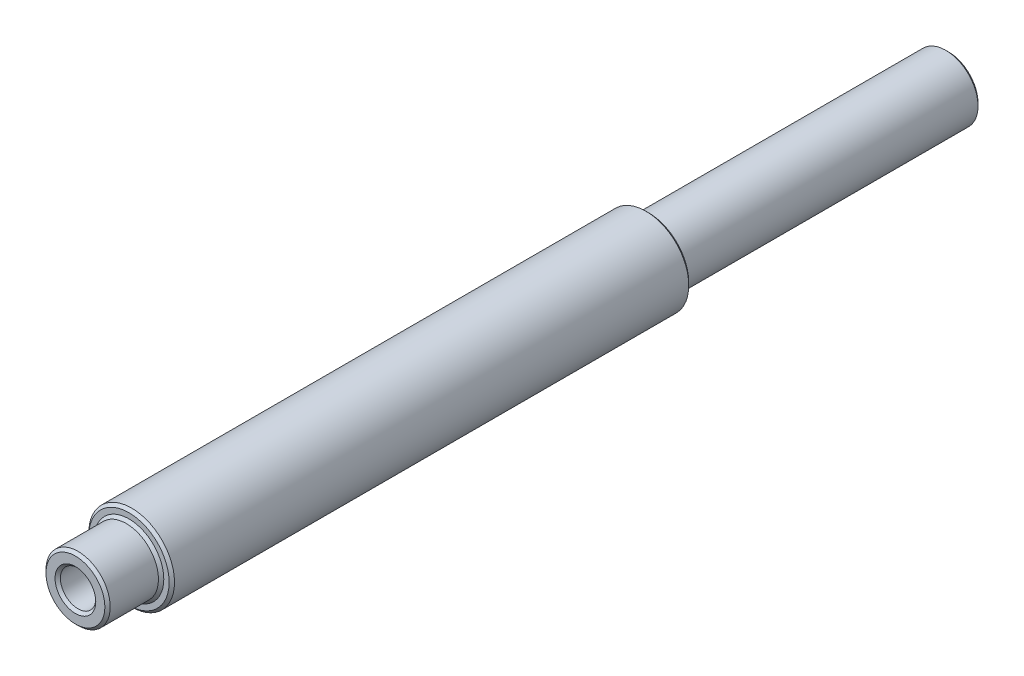
ISO-10303-21;
HEADER;
FILE_DESCRIPTION(('STEP AP214'),'2;1');
FILE_NAME('part.step','',(''),(''),'','','');
FILE_SCHEMA(('AUTOMOTIVE_DESIGN { 1 0 10303 214 1 1 1 1 }'));
ENDSEC;
DATA;
#1=APPLICATION_CONTEXT('core data for automotive mechanical design processes');
#2=APPLICATION_PROTOCOL_DEFINITION('international standard','automotive_design',2000,#1);
#3=PRODUCT_CONTEXT('',#1,'mechanical');
#4=PRODUCT('Part','Part','',(#3));
#5=PRODUCT_RELATED_PRODUCT_CATEGORY('part','',(#4));
#6=PRODUCT_DEFINITION_FORMATION('','',#4);
#7=PRODUCT_DEFINITION_CONTEXT('part definition',#1,'design');
#8=PRODUCT_DEFINITION('design','',#6,#7);
#9=PRODUCT_DEFINITION_SHAPE('','',#8);
#10=(LENGTH_UNIT() NAMED_UNIT(*) SI_UNIT(.MILLI.,.METRE.));
#11=(NAMED_UNIT(*) PLANE_ANGLE_UNIT() SI_UNIT($,.RADIAN.));
#12=(NAMED_UNIT(*) SI_UNIT($,.STERADIAN.) SOLID_ANGLE_UNIT());
#13=UNCERTAINTY_MEASURE_WITH_UNIT(LENGTH_MEASURE(1.E-05),#10,'distance_accuracy_value','');
#14=(GEOMETRIC_REPRESENTATION_CONTEXT(3) GLOBAL_UNCERTAINTY_ASSIGNED_CONTEXT((#13)) GLOBAL_UNIT_ASSIGNED_CONTEXT((#10,
#11,#12)) REPRESENTATION_CONTEXT('',''));
#15=CARTESIAN_POINT('',(0.,0.,0.));
#16=DIRECTION('',(0.,0.,1.));
#17=DIRECTION('',(1.,0.,0.));
#18=AXIS2_PLACEMENT_3D('',#15,#16,#17);
#19=CARTESIAN_POINT('',(0.,0.,81.5));
#20=DIRECTION('',(0.,0.,-1.));
#21=DIRECTION('',(-1.,0.,0.));
#22=AXIS2_PLACEMENT_3D('',#19,#20,#21);
#23=CYLINDRICAL_SURFACE('',#22,4.);
#24=CARTESIAN_POINT('',(0.,0.,28.25));
#25=DIRECTION('',(0.,0.,1.));
#26=DIRECTION('',(1.,0.,0.));
#27=AXIS2_PLACEMENT_3D('',#24,#25,#26);
#28=CIRCLE('',#27,4.);
#29=CARTESIAN_POINT('',(4.,0.,28.25));
#30=VERTEX_POINT('',#29);
#31=EDGE_CURVE('E64',#30,#30,#28,.T.);
#32=ORIENTED_EDGE('',*,*,#31,.T.);
#33=EDGE_LOOP('',(#32));
#34=FACE_BOUND('',#33,.T.);
#35=CARTESIAN_POINT('',(0.,0.,76.25));
#36=DIRECTION('',(0.,0.,1.));
#37=DIRECTION('',(1.,0.,0.));
#38=AXIS2_PLACEMENT_3D('',#35,#36,#37);
#39=CIRCLE('',#38,4.);
#40=CARTESIAN_POINT('',(4.,0.,76.25));
#41=VERTEX_POINT('',#40);
#42=EDGE_CURVE('E67',#41,#41,#39,.F.);
#43=ORIENTED_EDGE('',*,*,#42,.T.);
#44=EDGE_LOOP('',(#43));
#45=FACE_BOUND('',#44,.T.);
#46=ADVANCED_FACE('F32',(#34,#45),#23,.T.);
#47=CARTESIAN_POINT('',(0.,0.,0.));
#48=DIRECTION('',(0.,0.,-1.));
#49=DIRECTION('',(-1.,0.,0.));
#50=AXIS2_PLACEMENT_3D('',#47,#48,#49);
#51=CYLINDRICAL_SURFACE('',#50,3.);
#52=CARTESIAN_POINT('',(0.,0.,0.250000000000006));
#53=DIRECTION('',(0.,0.,1.));
#54=DIRECTION('',(1.,0.,0.));
#55=AXIS2_PLACEMENT_3D('',#52,#53,#54);
#56=CIRCLE('',#55,3.);
#57=CARTESIAN_POINT('',(3.,0.,0.250000000000006));
#58=VERTEX_POINT('',#57);
#59=EDGE_CURVE('E76',#58,#58,#56,.T.);
#60=ORIENTED_EDGE('',*,*,#59,.T.);
#61=EDGE_LOOP('',(#60));
#62=FACE_BOUND('',#61,.T.);
#63=CARTESIAN_POINT('',(0.,0.,27.75));
#64=DIRECTION('',(0.,0.,1.));
#65=DIRECTION('',(1.,0.,0.));
#66=AXIS2_PLACEMENT_3D('',#63,#64,#65);
#67=CIRCLE('',#66,3.);
#68=CARTESIAN_POINT('',(3.,0.,27.75));
#69=VERTEX_POINT('',#68);
#70=EDGE_CURVE('E79',#69,#69,#67,.F.);
#71=ORIENTED_EDGE('',*,*,#70,.T.);
#72=EDGE_LOOP('',(#71));
#73=FACE_BOUND('',#72,.T.);
#74=ADVANCED_FACE('F100',(#62,#73),#51,.T.);
#75=CARTESIAN_POINT('',(0.,4.,28.));
#76=DIRECTION('',(0.,0.,1.));
#77=DIRECTION('',(1.,0.,0.));
#78=AXIS2_PLACEMENT_3D('',#75,#76,#77);
#79=PLANE('',#78);
#80=CARTESIAN_POINT('',(0.,0.,28.));
#81=DIRECTION('',(0.,0.,1.));
#82=DIRECTION('',(1.,0.,0.));
#83=AXIS2_PLACEMENT_3D('',#80,#81,#82);
#84=CIRCLE('',#83,3.24999999999998);
#85=CARTESIAN_POINT('',(3.24999999999998,0.,28.));
#86=VERTEX_POINT('',#85);
#87=EDGE_CURVE('E70',#86,#86,#84,.T.);
#88=ORIENTED_EDGE('',*,*,#87,.T.);
#89=EDGE_LOOP('',(#88));
#90=FACE_BOUND('',#89,.T.);
#91=CARTESIAN_POINT('',(0.,0.,28.));
#92=DIRECTION('',(0.,0.,1.));
#93=DIRECTION('',(1.,0.,0.));
#94=AXIS2_PLACEMENT_3D('',#91,#92,#93);
#95=CIRCLE('',#94,3.75);
#96=CARTESIAN_POINT('',(3.75,0.,28.));
#97=VERTEX_POINT('',#96);
#98=EDGE_CURVE('E73',#97,#97,#95,.F.);
#99=ORIENTED_EDGE('',*,*,#98,.T.);
#100=EDGE_LOOP('',(#99));
#101=FACE_BOUND('',#100,.T.);
#102=ADVANCED_FACE('F106',(#90,#101),#79,.F.);
#103=CARTESIAN_POINT('',(0.,0.,0.));
#104=DIRECTION('',(0.,0.,1.));
#105=DIRECTION('',(1.,0.,0.));
#106=AXIS2_PLACEMENT_3D('',#103,#104,#105);
#107=PLANE('',#106);
#108=CARTESIAN_POINT('',(0.,0.,0.));
#109=DIRECTION('',(0.,0.,1.));
#110=DIRECTION('',(1.,0.,0.));
#111=AXIS2_PLACEMENT_3D('',#108,#109,#110);
#112=CIRCLE('',#111,2.75);
#113=CARTESIAN_POINT('',(2.75,0.,0.));
#114=VERTEX_POINT('',#113);
#115=EDGE_CURVE('E82',#114,#114,#112,.F.);
#116=ORIENTED_EDGE('',*,*,#115,.T.);
#117=EDGE_LOOP('',(#116));
#118=FACE_BOUND('',#117,.T.);
#119=CARTESIAN_POINT('',(0.,0.,0.));
#120=DIRECTION('',(0.,0.,1.));
#121=DIRECTION('',(1.,0.,0.));
#122=AXIS2_PLACEMENT_3D('',#119,#120,#121);
#123=CIRCLE('',#122,1.9);
#124=CARTESIAN_POINT('',(1.9,0.,0.));
#125=VERTEX_POINT('',#124);
#126=EDGE_CURVE('E85',#125,#125,#123,.T.);
#127=ORIENTED_EDGE('',*,*,#126,.T.);
#128=EDGE_LOOP('',(#127));
#129=FACE_BOUND('',#128,.T.);
#130=ADVANCED_FACE('F89',(#118,#129),#107,.F.);
#131=CARTESIAN_POINT('',(0.,0.,81.5));
#132=DIRECTION('',(0.,0.,1.));
#133=DIRECTION('',(1.,0.,0.));
#134=AXIS2_PLACEMENT_3D('',#131,#132,#133);
#135=CYLINDRICAL_SURFACE('',#134,3.);
#136=CARTESIAN_POINT('',(0.,0.,81.25));
#137=DIRECTION('',(0.,0.,1.));
#138=DIRECTION('',(1.,0.,0.));
#139=AXIS2_PLACEMENT_3D('',#136,#137,#138);
#140=CIRCLE('',#139,3.);
#141=CARTESIAN_POINT('',(3.,0.,81.25));
#142=VERTEX_POINT('',#141);
#143=EDGE_CURVE('E52',#142,#142,#140,.F.);
#144=ORIENTED_EDGE('',*,*,#143,.T.);
#145=EDGE_LOOP('',(#144));
#146=FACE_BOUND('',#145,.T.);
#147=CARTESIAN_POINT('',(0.,0.,76.75));
#148=DIRECTION('',(0.,0.,1.));
#149=DIRECTION('',(1.,0.,0.));
#150=AXIS2_PLACEMENT_3D('',#147,#148,#149);
#151=CIRCLE('',#150,3.);
#152=CARTESIAN_POINT('',(3.,0.,76.75));
#153=VERTEX_POINT('',#152);
#154=EDGE_CURVE('E55',#153,#153,#151,.T.);
#155=ORIENTED_EDGE('',*,*,#154,.T.);
#156=EDGE_LOOP('',(#155));
#157=FACE_BOUND('',#156,.T.);
#158=ADVANCED_FACE('F145',(#146,#157),#135,.T.);
#159=CARTESIAN_POINT('',(0.,4.,76.5));
#160=DIRECTION('',(0.,0.,1.));
#161=DIRECTION('',(1.,0.,0.));
#162=AXIS2_PLACEMENT_3D('',#159,#160,#161);
#163=PLANE('',#162);
#164=CARTESIAN_POINT('',(0.,0.,76.5));
#165=DIRECTION('',(0.,0.,1.));
#166=DIRECTION('',(1.,0.,0.));
#167=AXIS2_PLACEMENT_3D('',#164,#165,#166);
#168=CIRCLE('',#167,3.25);
#169=CARTESIAN_POINT('',(3.25,0.,76.5));
#170=VERTEX_POINT('',#169);
#171=EDGE_CURVE('E43',#170,#170,#168,.F.);
#172=ORIENTED_EDGE('',*,*,#171,.T.);
#173=EDGE_LOOP('',(#172));
#174=FACE_BOUND('',#173,.T.);
#175=CARTESIAN_POINT('',(0.,0.,76.5));
#176=DIRECTION('',(0.,0.,1.));
#177=DIRECTION('',(1.,0.,0.));
#178=AXIS2_PLACEMENT_3D('',#175,#176,#177);
#179=CIRCLE('',#178,3.75000000000001);
#180=CARTESIAN_POINT('',(3.75000000000001,0.,76.5));
#181=VERTEX_POINT('',#180);
#182=EDGE_CURVE('E47',#181,#181,#179,.T.);
#183=ORIENTED_EDGE('',*,*,#182,.T.);
#184=EDGE_LOOP('',(#183));
#185=FACE_BOUND('',#184,.T.);
#186=ADVANCED_FACE('F142',(#174,#185),#163,.T.);
#187=CARTESIAN_POINT('',(0.,0.,81.5));
#188=DIRECTION('',(0.,0.,1.));
#189=DIRECTION('',(1.,0.,0.));
#190=AXIS2_PLACEMENT_3D('',#187,#188,#189);
#191=PLANE('',#190);
#192=CARTESIAN_POINT('',(0.,0.,81.5));
#193=DIRECTION('',(0.,0.,1.));
#194=DIRECTION('',(1.,0.,0.));
#195=AXIS2_PLACEMENT_3D('',#192,#193,#194);
#196=CIRCLE('',#195,2.75);
#197=CARTESIAN_POINT('',(2.75,0.,81.5));
#198=VERTEX_POINT('',#197);
#199=EDGE_CURVE('E58',#198,#198,#196,.T.);
#200=ORIENTED_EDGE('',*,*,#199,.T.);
#201=EDGE_LOOP('',(#200));
#202=FACE_BOUND('',#201,.T.);
#203=CARTESIAN_POINT('',(0.,0.,81.5));
#204=DIRECTION('',(0.,0.,1.));
#205=DIRECTION('',(1.,0.,0.));
#206=AXIS2_PLACEMENT_3D('',#203,#204,#205);
#207=CIRCLE('',#206,1.89999999999998);
#208=CARTESIAN_POINT('',(1.89999999999998,0.,81.5));
#209=VERTEX_POINT('',#208);
#210=EDGE_CURVE('E61',#209,#209,#207,.F.);
#211=ORIENTED_EDGE('',*,*,#210,.T.);
#212=EDGE_LOOP('',(#211));
#213=FACE_BOUND('',#212,.T.);
#214=ADVANCED_FACE('F144',(#202,#213),#191,.T.);
#215=CARTESIAN_POINT('',(0.,0.,81.5));
#216=DIRECTION('',(0.,0.,1.));
#217=DIRECTION('',(1.,0.,0.));
#218=AXIS2_PLACEMENT_3D('',#215,#216,#217);
#219=CYLINDRICAL_SURFACE('',#218,1.65);
#220=CARTESIAN_POINT('',(0.,0.,81.25));
#221=DIRECTION('',(0.,0.,1.));
#222=DIRECTION('',(1.,0.,0.));
#223=AXIS2_PLACEMENT_3D('',#220,#221,#222);
#224=CIRCLE('',#223,1.65);
#225=CARTESIAN_POINT('',(1.65,0.,81.25));
#226=VERTEX_POINT('',#225);
#227=EDGE_CURVE('E10',#226,#226,#224,.T.);
#228=ORIENTED_EDGE('',*,*,#227,.T.);
#229=EDGE_LOOP('',(#228));
#230=FACE_BOUND('',#229,.T.);
#231=CARTESIAN_POINT('',(0.,0.,0.25));
#232=DIRECTION('',(0.,0.,1.));
#233=DIRECTION('',(1.,0.,0.));
#234=AXIS2_PLACEMENT_3D('',#231,#232,#233);
#235=CIRCLE('',#234,1.65);
#236=CARTESIAN_POINT('',(1.65,0.,0.25));
#237=VERTEX_POINT('',#236);
#238=EDGE_CURVE('E39',#237,#237,#235,.F.);
#239=ORIENTED_EDGE('',*,*,#238,.T.);
#240=EDGE_LOOP('',(#239));
#241=FACE_BOUND('',#240,.T.);
#242=ADVANCED_FACE('F117',(#230,#241),#219,.F.);
#243=CARTESIAN_POINT('',(0.,0.,0.));
#244=DIRECTION('',(0.,0.,1.));
#245=DIRECTION('',(1.,0.,0.));
#246=AXIS2_PLACEMENT_3D('',#243,#244,#245);
#247=CONICAL_SURFACE('',#246,2.75,0.785398163397441);
#248=ORIENTED_EDGE('',*,*,#59,.F.);
#249=EDGE_LOOP('',(#248));
#250=FACE_BOUND('',#249,.T.);
#251=ORIENTED_EDGE('',*,*,#115,.F.);
#252=EDGE_LOOP('',(#251));
#253=FACE_BOUND('',#252,.T.);
#254=ADVANCED_FACE('F113',(#250,#253),#247,.T.);
#255=CARTESIAN_POINT('',(0.,0.,27.75));
#256=DIRECTION('',(0.,0.,1.));
#257=DIRECTION('',(1.,0.,0.));
#258=AXIS2_PLACEMENT_3D('',#255,#256,#257);
#259=CONICAL_SURFACE('',#258,3.,0.785398163397443);
#260=ORIENTED_EDGE('',*,*,#87,.F.);
#261=EDGE_LOOP('',(#260));
#262=FACE_BOUND('',#261,.T.);
#263=ORIENTED_EDGE('',*,*,#70,.F.);
#264=EDGE_LOOP('',(#263));
#265=FACE_BOUND('',#264,.T.);
#266=ADVANCED_FACE('F116',(#262,#265),#259,.T.);
#267=CARTESIAN_POINT('',(0.,0.,28.));
#268=DIRECTION('',(0.,0.,1.));
#269=DIRECTION('',(1.,0.,0.));
#270=AXIS2_PLACEMENT_3D('',#267,#268,#269);
#271=CONICAL_SURFACE('',#270,3.75,0.785398163397455);
#272=ORIENTED_EDGE('',*,*,#31,.F.);
#273=EDGE_LOOP('',(#272));
#274=FACE_BOUND('',#273,.T.);
#275=ORIENTED_EDGE('',*,*,#98,.F.);
#276=EDGE_LOOP('',(#275));
#277=FACE_BOUND('',#276,.T.);
#278=ADVANCED_FACE('F121',(#274,#277),#271,.T.);
#279=CARTESIAN_POINT('',(0.,0.,81.5));
#280=DIRECTION('',(0.,0.,-1.));
#281=DIRECTION('',(-1.,0.,0.));
#282=AXIS2_PLACEMENT_3D('',#279,#280,#281);
#283=CONICAL_SURFACE('',#282,2.75,0.78539816339743);
#284=ORIENTED_EDGE('',*,*,#143,.F.);
#285=EDGE_LOOP('',(#284));
#286=FACE_BOUND('',#285,.T.);
#287=ORIENTED_EDGE('',*,*,#199,.F.);
#288=EDGE_LOOP('',(#287));
#289=FACE_BOUND('',#288,.T.);
#290=ADVANCED_FACE('F125',(#286,#289),#283,.T.);
#291=CARTESIAN_POINT('',(0.,0.,76.75));
#292=DIRECTION('',(0.,0.,-1.));
#293=DIRECTION('',(-1.,0.,0.));
#294=AXIS2_PLACEMENT_3D('',#291,#292,#293);
#295=CONICAL_SURFACE('',#294,3.,0.785398163397453);
#296=ORIENTED_EDGE('',*,*,#171,.F.);
#297=EDGE_LOOP('',(#296));
#298=FACE_BOUND('',#297,.T.);
#299=ORIENTED_EDGE('',*,*,#154,.F.);
#300=EDGE_LOOP('',(#299));
#301=FACE_BOUND('',#300,.T.);
#302=ADVANCED_FACE('F129',(#298,#301),#295,.T.);
#303=CARTESIAN_POINT('',(0.,0.,76.5));
#304=DIRECTION('',(0.,0.,-1.));
#305=DIRECTION('',(-1.,0.,0.));
#306=AXIS2_PLACEMENT_3D('',#303,#304,#305);
#307=CONICAL_SURFACE('',#306,3.75000000000001,0.785398163397428);
#308=ORIENTED_EDGE('',*,*,#42,.F.);
#309=EDGE_LOOP('',(#308));
#310=FACE_BOUND('',#309,.T.);
#311=ORIENTED_EDGE('',*,*,#182,.F.);
#312=EDGE_LOOP('',(#311));
#313=FACE_BOUND('',#312,.T.);
#314=ADVANCED_FACE('F97',(#310,#313),#307,.T.);
#315=CARTESIAN_POINT('',(0.,0.,81.25));
#316=DIRECTION('',(0.,0.,1.));
#317=DIRECTION('',(1.,0.,0.));
#318=AXIS2_PLACEMENT_3D('',#315,#316,#317);
#319=CONICAL_SURFACE('',#318,1.65,0.785398163397437);
#320=ORIENTED_EDGE('',*,*,#210,.F.);
#321=EDGE_LOOP('',(#320));
#322=FACE_BOUND('',#321,.T.);
#323=ORIENTED_EDGE('',*,*,#227,.F.);
#324=EDGE_LOOP('',(#323));
#325=FACE_BOUND('',#324,.T.);
#326=ADVANCED_FACE('F93',(#322,#325),#319,.F.);
#327=CARTESIAN_POINT('',(0.,0.,0.25));
#328=DIRECTION('',(0.,0.,-1.));
#329=DIRECTION('',(-1.,0.,0.));
#330=AXIS2_PLACEMENT_3D('',#327,#328,#329);
#331=CONICAL_SURFACE('',#330,1.65,0.785398163397451);
#332=ORIENTED_EDGE('',*,*,#126,.F.);
#333=EDGE_LOOP('',(#332));
#334=FACE_BOUND('',#333,.T.);
#335=ORIENTED_EDGE('',*,*,#238,.F.);
#336=EDGE_LOOP('',(#335));
#337=FACE_BOUND('',#336,.T.);
#338=ADVANCED_FACE('F34',(#334,#337),#331,.F.);
#339=CLOSED_SHELL('',(#46,#74,#102,#130,#158,#186,#214,#242,#254,#266,#278,#290,#302,#314,#326,#338));
#340=MANIFOLD_SOLID_BREP('B2',#339);
#341=ADVANCED_BREP_SHAPE_REPRESENTATION('',(#18,#340),#14);
#342=SHAPE_DEFINITION_REPRESENTATION(#9,#341);
ENDSEC;
END-ISO-10303-21;
